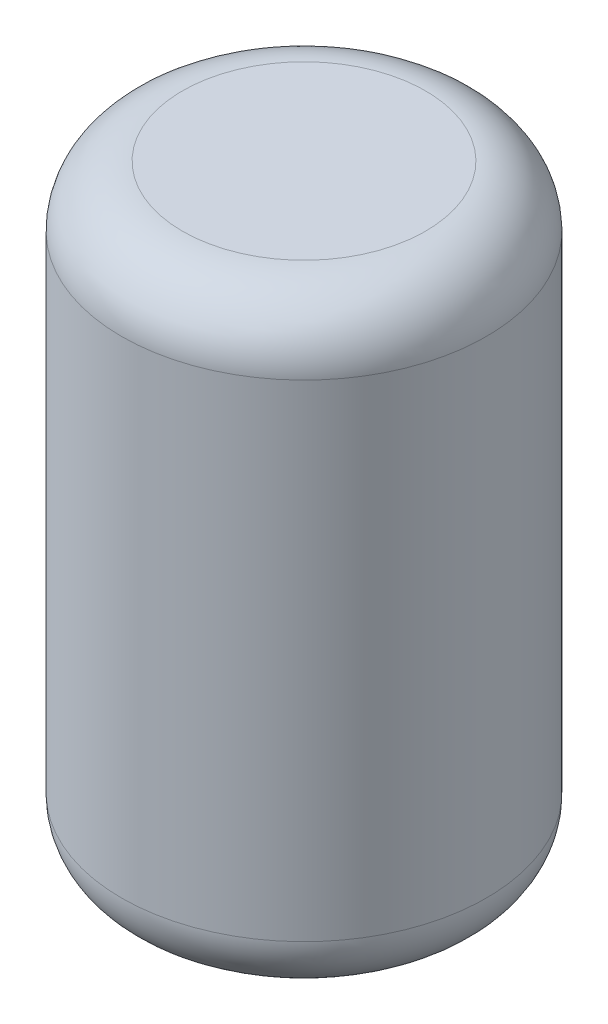
ISO-10303-21;
HEADER;
FILE_DESCRIPTION(('STEP AP214'),'2;1');
FILE_NAME('part.step','',(''),(''),'','','');
FILE_SCHEMA(('AUTOMOTIVE_DESIGN { 1 0 10303 214 1 1 1 1 }'));
ENDSEC;
DATA;
#1=APPLICATION_CONTEXT('core data for automotive mechanical design processes');
#2=APPLICATION_PROTOCOL_DEFINITION('international standard','automotive_design',2000,#1);
#3=PRODUCT_CONTEXT('',#1,'mechanical');
#4=PRODUCT('Part','Part','',(#3));
#5=PRODUCT_RELATED_PRODUCT_CATEGORY('part','',(#4));
#6=PRODUCT_DEFINITION_FORMATION('','',#4);
#7=PRODUCT_DEFINITION_CONTEXT('part definition',#1,'design');
#8=PRODUCT_DEFINITION('design','',#6,#7);
#9=PRODUCT_DEFINITION_SHAPE('','',#8);
#10=(LENGTH_UNIT() NAMED_UNIT(*) SI_UNIT(.MILLI.,.METRE.));
#11=(NAMED_UNIT(*) PLANE_ANGLE_UNIT() SI_UNIT($,.RADIAN.));
#12=(NAMED_UNIT(*) SI_UNIT($,.STERADIAN.) SOLID_ANGLE_UNIT());
#13=UNCERTAINTY_MEASURE_WITH_UNIT(LENGTH_MEASURE(1.E-05),#10,'distance_accuracy_value','');
#14=(GEOMETRIC_REPRESENTATION_CONTEXT(3) GLOBAL_UNCERTAINTY_ASSIGNED_CONTEXT((#13)) GLOBAL_UNIT_ASSIGNED_CONTEXT((#10,
#11,#12)) REPRESENTATION_CONTEXT('',''));
#15=CARTESIAN_POINT('',(0.,0.,0.));
#16=DIRECTION('',(0.,0.,1.));
#17=DIRECTION('',(1.,0.,0.));
#18=AXIS2_PLACEMENT_3D('',#15,#16,#17);
#19=CARTESIAN_POINT('',(0.,100.,0.));
#20=DIRECTION('',(0.,-1.,0.));
#21=DIRECTION('',(0.,0.,-1.));
#22=AXIS2_PLACEMENT_3D('',#19,#20,#21);
#23=CYLINDRICAL_SURFACE('',#22,30.);
#24=CARTESIAN_POINT('',(0.,9.99999999999999,0.));
#25=DIRECTION('',(0.,1.,0.));
#26=DIRECTION('',(0.,0.,1.));
#27=AXIS2_PLACEMENT_3D('',#24,#25,#26);
#28=CIRCLE('',#27,30.);
#29=CARTESIAN_POINT('',(0.,9.99999999999999,30.));
#30=VERTEX_POINT('',#29);
#31=EDGE_CURVE('E40',#30,#30,#28,.T.);
#32=ORIENTED_EDGE('',*,*,#31,.T.);
#33=EDGE_LOOP('',(#32));
#34=FACE_BOUND('',#33,.T.);
#35=CARTESIAN_POINT('',(0.,90.,0.));
#36=DIRECTION('',(0.,1.,0.));
#37=DIRECTION('',(0.,0.,1.));
#38=AXIS2_PLACEMENT_3D('',#35,#36,#37);
#39=CIRCLE('',#38,30.);
#40=CARTESIAN_POINT('',(0.,90.,30.));
#41=VERTEX_POINT('',#40);
#42=EDGE_CURVE('E44',#41,#41,#39,.F.);
#43=ORIENTED_EDGE('',*,*,#42,.T.);
#44=EDGE_LOOP('',(#43));
#45=FACE_BOUND('',#44,.T.);
#46=ADVANCED_FACE('F29',(#34,#45),#23,.T.);
#47=CARTESIAN_POINT('',(0.,100.,0.));
#48=DIRECTION('',(0.,1.,0.));
#49=DIRECTION('',(0.,0.,1.));
#50=AXIS2_PLACEMENT_3D('',#47,#48,#49);
#51=PLANE('',#50);
#52=CARTESIAN_POINT('',(0.,100.,0.));
#53=DIRECTION('',(0.,1.,0.));
#54=DIRECTION('',(0.,0.,1.));
#55=AXIS2_PLACEMENT_3D('',#52,#53,#54);
#56=CIRCLE('',#55,20.);
#57=CARTESIAN_POINT('',(0.,100.,20.));
#58=VERTEX_POINT('',#57);
#59=EDGE_CURVE('E10',#58,#58,#56,.T.);
#60=ORIENTED_EDGE('',*,*,#59,.T.);
#61=EDGE_LOOP('',(#60));
#62=FACE_BOUND('',#61,.T.);
#63=ADVANCED_FACE('F60',(#62),#51,.T.);
#64=CARTESIAN_POINT('',(0.,0.,0.));
#65=DIRECTION('',(0.,1.,0.));
#66=DIRECTION('',(0.,0.,1.));
#67=AXIS2_PLACEMENT_3D('',#64,#65,#66);
#68=PLANE('',#67);
#69=CARTESIAN_POINT('',(0.,0.,0.));
#70=DIRECTION('',(0.,1.,0.));
#71=DIRECTION('',(0.,0.,1.));
#72=AXIS2_PLACEMENT_3D('',#69,#70,#71);
#73=CIRCLE('',#72,20.);
#74=CARTESIAN_POINT('',(0.,0.,20.));
#75=VERTEX_POINT('',#74);
#76=EDGE_CURVE('E36',#75,#75,#73,.F.);
#77=ORIENTED_EDGE('',*,*,#76,.T.);
#78=EDGE_LOOP('',(#77));
#79=FACE_BOUND('',#78,.T.);
#80=ADVANCED_FACE('F57',(#79),#68,.F.);
#81=CARTESIAN_POINT('',(0.,9.99999999999999,0.));
#82=DIRECTION('',(0.,1.,0.));
#83=DIRECTION('',(0.,0.,1.));
#84=AXIS2_PLACEMENT_3D('',#81,#82,#83);
#85=TOROIDAL_SURFACE('',#84,20.,10.);
#86=ORIENTED_EDGE('',*,*,#76,.F.);
#87=EDGE_LOOP('',(#86));
#88=FACE_BOUND('',#87,.T.);
#89=ORIENTED_EDGE('',*,*,#31,.F.);
#90=EDGE_LOOP('',(#89));
#91=FACE_BOUND('',#90,.T.);
#92=ADVANCED_FACE('F53',(#88,#91),#85,.T.);
#93=CARTESIAN_POINT('',(0.,90.,0.));
#94=DIRECTION('',(0.,1.,0.));
#95=DIRECTION('',(0.,0.,1.));
#96=AXIS2_PLACEMENT_3D('',#93,#94,#95);
#97=TOROIDAL_SURFACE('',#96,20.,10.);
#98=ORIENTED_EDGE('',*,*,#42,.F.);
#99=EDGE_LOOP('',(#98));
#100=FACE_BOUND('',#99,.T.);
#101=ORIENTED_EDGE('',*,*,#59,.F.);
#102=EDGE_LOOP('',(#101));
#103=FACE_BOUND('',#102,.T.);
#104=ADVANCED_FACE('F31',(#100,#103),#97,.T.);
#105=CLOSED_SHELL('',(#46,#63,#80,#92,#104));
#106=MANIFOLD_SOLID_BREP('B2',#105);
#107=ADVANCED_BREP_SHAPE_REPRESENTATION('',(#18,#106),#14);
#108=SHAPE_DEFINITION_REPRESENTATION(#9,#107);
ENDSEC;
END-ISO-10303-21;
